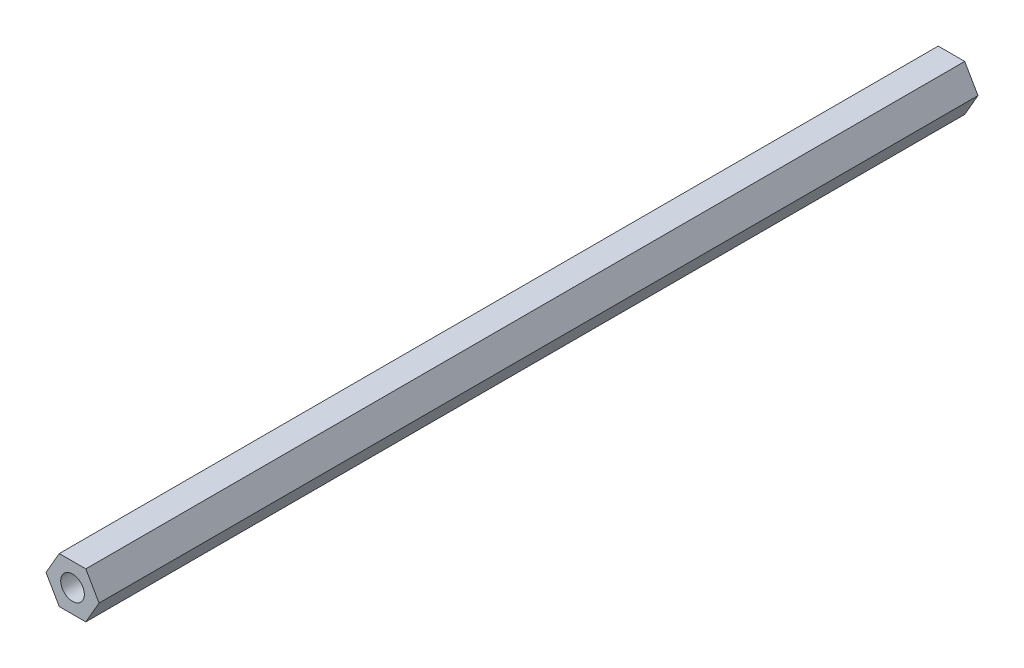
ISO-10303-21;
HEADER;
FILE_DESCRIPTION(('STEP AP214'),'2;1');
FILE_NAME('part.step','',(''),(''),'','','');
FILE_SCHEMA(('AUTOMOTIVE_DESIGN { 1 0 10303 214 1 1 1 1 }'));
ENDSEC;
DATA;
#1=APPLICATION_CONTEXT('core data for automotive mechanical design processes');
#2=APPLICATION_PROTOCOL_DEFINITION('international standard','automotive_design',2000,#1);
#3=PRODUCT_CONTEXT('',#1,'mechanical');
#4=PRODUCT('Part','Part','',(#3));
#5=PRODUCT_RELATED_PRODUCT_CATEGORY('part','',(#4));
#6=PRODUCT_DEFINITION_FORMATION('','',#4);
#7=PRODUCT_DEFINITION_CONTEXT('part definition',#1,'design');
#8=PRODUCT_DEFINITION('design','',#6,#7);
#9=PRODUCT_DEFINITION_SHAPE('','',#8);
#10=(LENGTH_UNIT() NAMED_UNIT(*) SI_UNIT(.MILLI.,.METRE.));
#11=(NAMED_UNIT(*) PLANE_ANGLE_UNIT() SI_UNIT($,.RADIAN.));
#12=(NAMED_UNIT(*) SI_UNIT($,.STERADIAN.) SOLID_ANGLE_UNIT());
#13=UNCERTAINTY_MEASURE_WITH_UNIT(LENGTH_MEASURE(1.E-05),#10,'distance_accuracy_value','');
#14=(GEOMETRIC_REPRESENTATION_CONTEXT(3) GLOBAL_UNCERTAINTY_ASSIGNED_CONTEXT((#13)) GLOBAL_UNIT_ASSIGNED_CONTEXT((#10,
#11,#12)) REPRESENTATION_CONTEXT('',''));
#15=CARTESIAN_POINT('',(0.,0.,0.));
#16=DIRECTION('',(0.,0.,1.));
#17=DIRECTION('',(1.,0.,0.));
#18=AXIS2_PLACEMENT_3D('',#15,#16,#17);
#19=CARTESIAN_POINT('',(0.,0.,242.8875));
#20=DIRECTION('',(0.,0.,1.));
#21=DIRECTION('',(1.,0.,0.));
#22=AXIS2_PLACEMENT_3D('',#19,#20,#21);
#23=PLANE('',#22);
#24=DIRECTION('',(-1.,0.,0.));
#25=VECTOR('',#24,1.);
#26=CARTESIAN_POINT('',(3.66617420935412,6.35,242.8875));
#27=LINE('',#26,#25);
#28=CARTESIAN_POINT('',(3.66617420935412,6.35,242.8875));
#29=VERTEX_POINT('',#28);
#30=CARTESIAN_POINT('',(-3.66617420935412,6.35,242.8875));
#31=VERTEX_POINT('',#30);
#32=EDGE_CURVE('E132',#29,#31,#27,.T.);
#33=ORIENTED_EDGE('',*,*,#32,.T.);
#34=DIRECTION('',(-0.5,-0.866025403784439,0.));
#35=VECTOR('',#34,1.);
#36=CARTESIAN_POINT('',(-3.66617420935412,6.35,242.8875));
#37=LINE('',#36,#35);
#38=CARTESIAN_POINT('',(-7.33234841870825,0.,242.8875));
#39=VERTEX_POINT('',#38);
#40=EDGE_CURVE('E90',#31,#39,#37,.T.);
#41=ORIENTED_EDGE('',*,*,#40,.T.);
#42=DIRECTION('',(0.5,-0.866025403784439,0.));
#43=VECTOR('',#42,1.);
#44=CARTESIAN_POINT('',(-7.33234841870825,0.,242.8875));
#45=LINE('',#44,#43);
#46=CARTESIAN_POINT('',(-3.66617420935412,-6.35,242.8875));
#47=VERTEX_POINT('',#46);
#48=EDGE_CURVE('E103',#39,#47,#45,.T.);
#49=ORIENTED_EDGE('',*,*,#48,.T.);
#50=DIRECTION('',(1.,0.,0.));
#51=VECTOR('',#50,1.);
#52=CARTESIAN_POINT('',(-3.66617420935412,-6.35,242.8875));
#53=LINE('',#52,#51);
#54=CARTESIAN_POINT('',(3.66617420935412,-6.35,242.8875));
#55=VERTEX_POINT('',#54);
#56=EDGE_CURVE('E97',#47,#55,#53,.T.);
#57=ORIENTED_EDGE('',*,*,#56,.T.);
#58=DIRECTION('',(0.5,0.866025403784439,0.));
#59=VECTOR('',#58,1.);
#60=CARTESIAN_POINT('',(3.66617420935412,-6.35,242.8875));
#61=LINE('',#60,#59);
#62=CARTESIAN_POINT('',(7.33234841870825,0.,242.8875));
#63=VERTEX_POINT('',#62);
#64=EDGE_CURVE('E101',#55,#63,#61,.T.);
#65=ORIENTED_EDGE('',*,*,#64,.T.);
#66=DIRECTION('',(-0.5,0.866025403784439,0.));
#67=VECTOR('',#66,1.);
#68=CARTESIAN_POINT('',(7.33234841870825,0.,242.8875));
#69=LINE('',#68,#67);
#70=EDGE_CURVE('E53',#63,#29,#69,.T.);
#71=ORIENTED_EDGE('',*,*,#70,.T.);
#72=EDGE_LOOP('',(#33,#41,#49,#57,#65,#71));
#73=FACE_BOUND('',#72,.T.);
#74=CARTESIAN_POINT('',(0.,0.,242.8875));
#75=DIRECTION('',(0.,0.,1.));
#76=DIRECTION('',(1.,0.,0.));
#77=AXIS2_PLACEMENT_3D('',#74,#75,#76);
#78=CIRCLE('',#77,3.2639);
#79=CARTESIAN_POINT('',(3.2639,0.,242.8875));
#80=VERTEX_POINT('',#79);
#81=EDGE_CURVE('E125',#80,#80,#78,.T.);
#82=ORIENTED_EDGE('',*,*,#81,.F.);
#83=EDGE_LOOP('',(#82));
#84=FACE_BOUND('',#83,.T.);
#85=ADVANCED_FACE('F36',(#73,#84),#23,.T.);
#86=CARTESIAN_POINT('',(0.,0.,0.));
#87=DIRECTION('',(0.,0.,1.));
#88=DIRECTION('',(1.,0.,0.));
#89=AXIS2_PLACEMENT_3D('',#86,#87,#88);
#90=PLANE('',#89);
#91=DIRECTION('',(-1.,0.,0.));
#92=VECTOR('',#91,1.);
#93=CARTESIAN_POINT('',(3.66617420935412,6.35,0.));
#94=LINE('',#93,#92);
#95=CARTESIAN_POINT('',(3.66617420935412,6.35,0.));
#96=VERTEX_POINT('',#95);
#97=CARTESIAN_POINT('',(-3.66617420935412,6.35,0.));
#98=VERTEX_POINT('',#97);
#99=EDGE_CURVE('E121',#96,#98,#94,.T.);
#100=ORIENTED_EDGE('',*,*,#99,.F.);
#101=DIRECTION('',(-0.5,0.866025403784439,0.));
#102=VECTOR('',#101,1.);
#103=CARTESIAN_POINT('',(7.33234841870825,0.,0.));
#104=LINE('',#103,#102);
#105=CARTESIAN_POINT('',(7.33234841870825,0.,0.));
#106=VERTEX_POINT('',#105);
#107=EDGE_CURVE('E82',#106,#96,#104,.T.);
#108=ORIENTED_EDGE('',*,*,#107,.F.);
#109=DIRECTION('',(0.5,0.866025403784439,0.));
#110=VECTOR('',#109,1.);
#111=CARTESIAN_POINT('',(3.66617420935412,-6.35,0.));
#112=LINE('',#111,#110);
#113=CARTESIAN_POINT('',(3.66617420935412,-6.35,0.));
#114=VERTEX_POINT('',#113);
#115=EDGE_CURVE('E76',#114,#106,#112,.T.);
#116=ORIENTED_EDGE('',*,*,#115,.F.);
#117=DIRECTION('',(1.,0.,0.));
#118=VECTOR('',#117,1.);
#119=CARTESIAN_POINT('',(-3.66617420935412,-6.35,0.));
#120=LINE('',#119,#118);
#121=CARTESIAN_POINT('',(-3.66617420935412,-6.35,0.));
#122=VERTEX_POINT('',#121);
#123=EDGE_CURVE('E111',#122,#114,#120,.T.);
#124=ORIENTED_EDGE('',*,*,#123,.F.);
#125=DIRECTION('',(0.5,-0.866025403784439,0.));
#126=VECTOR('',#125,1.);
#127=CARTESIAN_POINT('',(-7.33234841870825,0.,0.));
#128=LINE('',#127,#126);
#129=CARTESIAN_POINT('',(-7.33234841870825,0.,0.));
#130=VERTEX_POINT('',#129);
#131=EDGE_CURVE('E127',#130,#122,#128,.T.);
#132=ORIENTED_EDGE('',*,*,#131,.F.);
#133=DIRECTION('',(-0.5,-0.866025403784439,0.));
#134=VECTOR('',#133,1.);
#135=CARTESIAN_POINT('',(-3.66617420935412,6.35,0.));
#136=LINE('',#135,#134);
#137=EDGE_CURVE('E124',#98,#130,#136,.T.);
#138=ORIENTED_EDGE('',*,*,#137,.F.);
#139=EDGE_LOOP('',(#100,#108,#116,#124,#132,#138));
#140=FACE_BOUND('',#139,.T.);
#141=CARTESIAN_POINT('',(0.,0.,0.));
#142=DIRECTION('',(0.,0.,1.));
#143=DIRECTION('',(1.,0.,0.));
#144=AXIS2_PLACEMENT_3D('',#141,#142,#143);
#145=CIRCLE('',#144,3.2639);
#146=CARTESIAN_POINT('',(3.2639,0.,0.));
#147=VERTEX_POINT('',#146);
#148=EDGE_CURVE('E225',#147,#147,#145,.T.);
#149=ORIENTED_EDGE('',*,*,#148,.T.);
#150=EDGE_LOOP('',(#149));
#151=FACE_BOUND('',#150,.T.);
#152=ADVANCED_FACE('F141',(#140,#151),#90,.F.);
#153=CARTESIAN_POINT('',(3.66617420935412,6.35,242.8875));
#154=DIRECTION('',(0.,-1.,0.));
#155=DIRECTION('',(1.,0.,0.));
#156=AXIS2_PLACEMENT_3D('',#153,#154,#155);
#157=PLANE('',#156);
#158=ORIENTED_EDGE('',*,*,#99,.T.);
#159=DIRECTION('',(0.,0.,-1.));
#160=VECTOR('',#159,1.);
#161=CARTESIAN_POINT('',(-3.66617420935412,6.35,242.8875));
#162=LINE('',#161,#160);
#163=EDGE_CURVE('E11',#31,#98,#162,.T.);
#164=ORIENTED_EDGE('',*,*,#163,.F.);
#165=ORIENTED_EDGE('',*,*,#32,.F.);
#166=DIRECTION('',(0.,0.,-1.));
#167=VECTOR('',#166,1.);
#168=CARTESIAN_POINT('',(3.66617420935412,6.35,242.8875));
#169=LINE('',#168,#167);
#170=EDGE_CURVE('E117',#29,#96,#169,.T.);
#171=ORIENTED_EDGE('',*,*,#170,.T.);
#172=EDGE_LOOP('',(#158,#164,#165,#171));
#173=FACE_BOUND('',#172,.T.);
#174=ADVANCED_FACE('F38',(#173),#157,.F.);
#175=CARTESIAN_POINT('',(-3.66617420935412,6.35,242.8875));
#176=DIRECTION('',(0.866025403784439,-0.5,0.));
#177=DIRECTION('',(0.5,0.866025403784439,0.));
#178=AXIS2_PLACEMENT_3D('',#175,#176,#177);
#179=PLANE('',#178);
#180=ORIENTED_EDGE('',*,*,#137,.T.);
#181=DIRECTION('',(0.,0.,-1.));
#182=VECTOR('',#181,1.);
#183=CARTESIAN_POINT('',(-7.33234841870825,0.,242.8875));
#184=LINE('',#183,#182);
#185=EDGE_CURVE('E45',#39,#130,#184,.T.);
#186=ORIENTED_EDGE('',*,*,#185,.F.);
#187=ORIENTED_EDGE('',*,*,#40,.F.);
#188=ORIENTED_EDGE('',*,*,#163,.T.);
#189=EDGE_LOOP('',(#180,#186,#187,#188));
#190=FACE_BOUND('',#189,.T.);
#191=ADVANCED_FACE('F166',(#190),#179,.F.);
#192=CARTESIAN_POINT('',(-7.33234841870825,0.,242.8875));
#193=DIRECTION('',(0.866025403784439,0.5,0.));
#194=DIRECTION('',(-0.5,0.866025403784439,0.));
#195=AXIS2_PLACEMENT_3D('',#192,#193,#194);
#196=PLANE('',#195);
#197=ORIENTED_EDGE('',*,*,#131,.T.);
#198=DIRECTION('',(0.,0.,-1.));
#199=VECTOR('',#198,1.);
#200=CARTESIAN_POINT('',(-3.66617420935412,-6.35,242.8875));
#201=LINE('',#200,#199);
#202=EDGE_CURVE('E112',#47,#122,#201,.T.);
#203=ORIENTED_EDGE('',*,*,#202,.F.);
#204=ORIENTED_EDGE('',*,*,#48,.F.);
#205=ORIENTED_EDGE('',*,*,#185,.T.);
#206=EDGE_LOOP('',(#197,#203,#204,#205));
#207=FACE_BOUND('',#206,.T.);
#208=ADVANCED_FACE('F138',(#207),#196,.F.);
#209=CARTESIAN_POINT('',(-3.66617420935412,-6.35,242.8875));
#210=DIRECTION('',(0.,1.,0.));
#211=DIRECTION('',(-1.,0.,0.));
#212=AXIS2_PLACEMENT_3D('',#209,#210,#211);
#213=PLANE('',#212);
#214=ORIENTED_EDGE('',*,*,#123,.T.);
#215=DIRECTION('',(0.,0.,-1.));
#216=VECTOR('',#215,1.);
#217=CARTESIAN_POINT('',(3.66617420935412,-6.35,242.8875));
#218=LINE('',#217,#216);
#219=EDGE_CURVE('E108',#55,#114,#218,.T.);
#220=ORIENTED_EDGE('',*,*,#219,.F.);
#221=ORIENTED_EDGE('',*,*,#56,.F.);
#222=ORIENTED_EDGE('',*,*,#202,.T.);
#223=EDGE_LOOP('',(#214,#220,#221,#222));
#224=FACE_BOUND('',#223,.T.);
#225=ADVANCED_FACE('F109',(#224),#213,.F.);
#226=CARTESIAN_POINT('',(3.66617420935412,-6.35,242.8875));
#227=DIRECTION('',(-0.866025403784439,0.5,0.));
#228=DIRECTION('',(-0.5,-0.866025403784439,0.));
#229=AXIS2_PLACEMENT_3D('',#226,#227,#228);
#230=PLANE('',#229);
#231=ORIENTED_EDGE('',*,*,#115,.T.);
#232=DIRECTION('',(0.,0.,-1.));
#233=VECTOR('',#232,1.);
#234=CARTESIAN_POINT('',(7.33234841870825,0.,242.8875));
#235=LINE('',#234,#233);
#236=EDGE_CURVE('E113',#63,#106,#235,.T.);
#237=ORIENTED_EDGE('',*,*,#236,.F.);
#238=ORIENTED_EDGE('',*,*,#64,.F.);
#239=ORIENTED_EDGE('',*,*,#219,.T.);
#240=EDGE_LOOP('',(#231,#237,#238,#239));
#241=FACE_BOUND('',#240,.T.);
#242=ADVANCED_FACE('F115',(#241),#230,.F.);
#243=CARTESIAN_POINT('',(7.33234841870825,0.,242.8875));
#244=DIRECTION('',(-0.866025403784439,-0.5,0.));
#245=DIRECTION('',(0.5,-0.866025403784439,0.));
#246=AXIS2_PLACEMENT_3D('',#243,#244,#245);
#247=PLANE('',#246);
#248=ORIENTED_EDGE('',*,*,#107,.T.);
#249=ORIENTED_EDGE('',*,*,#170,.F.);
#250=ORIENTED_EDGE('',*,*,#70,.F.);
#251=ORIENTED_EDGE('',*,*,#236,.T.);
#252=EDGE_LOOP('',(#248,#249,#250,#251));
#253=FACE_BOUND('',#252,.T.);
#254=ADVANCED_FACE('F146',(#253),#247,.F.);
#255=CARTESIAN_POINT('',(0.,0.,242.8875));
#256=DIRECTION('',(0.,0.,-1.));
#257=DIRECTION('',(-1.,0.,0.));
#258=AXIS2_PLACEMENT_3D('',#255,#256,#257);
#259=CYLINDRICAL_SURFACE('',#258,3.2639);
#260=ORIENTED_EDGE('',*,*,#81,.T.);
#261=EDGE_LOOP('',(#260));
#262=FACE_BOUND('',#261,.T.);
#263=ORIENTED_EDGE('',*,*,#148,.F.);
#264=EDGE_LOOP('',(#263));
#265=FACE_BOUND('',#264,.T.);
#266=ADVANCED_FACE('F148',(#262,#265),#259,.F.);
#267=CLOSED_SHELL('',(#85,#152,#174,#191,#208,#225,#242,#254,#266));
#268=MANIFOLD_SOLID_BREP('B2',#267);
#269=ADVANCED_BREP_SHAPE_REPRESENTATION('',(#18,#268),#14);
#270=SHAPE_DEFINITION_REPRESENTATION(#9,#269);
ENDSEC;
END-ISO-10303-21;
